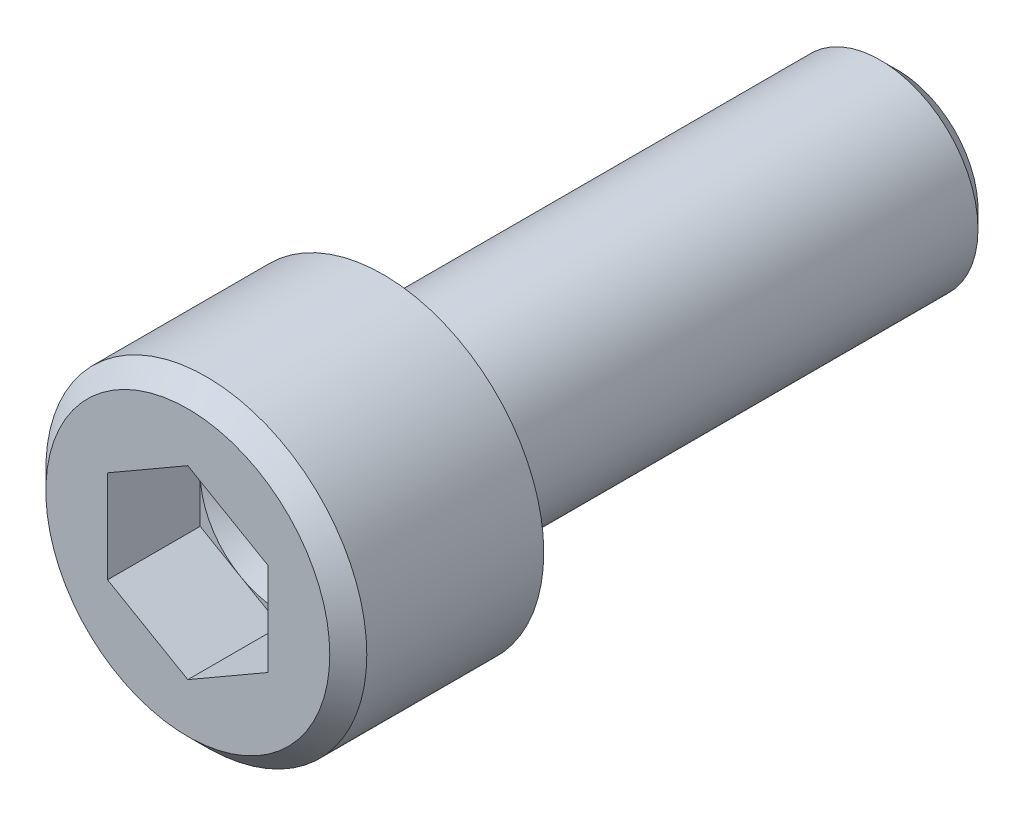
ISO-10303-21;
HEADER;
FILE_DESCRIPTION(('STEP AP214'),'2;1');
FILE_NAME('part.step','',(''),(''),'','','');
FILE_SCHEMA(('AUTOMOTIVE_DESIGN { 1 0 10303 214 1 1 1 1 }'));
ENDSEC;
DATA;
#1=APPLICATION_CONTEXT('core data for automotive mechanical design processes');
#2=APPLICATION_PROTOCOL_DEFINITION('international standard','automotive_design',2000,#1);
#3=PRODUCT_CONTEXT('',#1,'mechanical');
#4=PRODUCT('Part','Part','',(#3));
#5=PRODUCT_RELATED_PRODUCT_CATEGORY('part','',(#4));
#6=PRODUCT_DEFINITION_FORMATION('','',#4);
#7=PRODUCT_DEFINITION_CONTEXT('part definition',#1,'design');
#8=PRODUCT_DEFINITION('design','',#6,#7);
#9=PRODUCT_DEFINITION_SHAPE('','',#8);
#10=(LENGTH_UNIT() NAMED_UNIT(*) SI_UNIT(.MILLI.,.METRE.));
#11=(NAMED_UNIT(*) PLANE_ANGLE_UNIT() SI_UNIT($,.RADIAN.));
#12=(NAMED_UNIT(*) SI_UNIT($,.STERADIAN.) SOLID_ANGLE_UNIT());
#13=UNCERTAINTY_MEASURE_WITH_UNIT(LENGTH_MEASURE(1.E-05),#10,'distance_accuracy_value','');
#14=(GEOMETRIC_REPRESENTATION_CONTEXT(3) GLOBAL_UNCERTAINTY_ASSIGNED_CONTEXT((#13)) GLOBAL_UNIT_ASSIGNED_CONTEXT((#10,
#11,#12)) REPRESENTATION_CONTEXT('',''));
#15=CARTESIAN_POINT('',(0.,0.,0.));
#16=DIRECTION('',(0.,0.,1.));
#17=DIRECTION('',(1.,0.,0.));
#18=AXIS2_PLACEMENT_3D('',#15,#16,#17);
#19=CARTESIAN_POINT('',(0.,0.,2.54));
#20=DIRECTION('',(0.,0.,1.));
#21=DIRECTION('',(1.,0.,0.));
#22=AXIS2_PLACEMENT_3D('',#19,#20,#21);
#23=PLANE('',#22);
#24=DIRECTION('',(0.,1.,0.));
#25=VECTOR('',#24,1.);
#26=CARTESIAN_POINT('',(-1.9812,0.,2.54));
#27=LINE('',#26,#25);
#28=CARTESIAN_POINT('',(-1.9812,0.,2.54));
#29=VERTEX_POINT('',#28);
#30=CARTESIAN_POINT('',(-1.9812,1.14384635331848,2.54));
#31=VERTEX_POINT('',#30);
#32=EDGE_CURVE('E399',#29,#31,#27,.T.);
#33=ORIENTED_EDGE('',*,*,#32,.F.);
#34=CARTESIAN_POINT('',(0.,0.,2.54));
#35=DIRECTION('',(0.,0.,-1.));
#36=DIRECTION('',(-1.,0.,0.));
#37=AXIS2_PLACEMENT_3D('',#34,#35,#36);
#38=CIRCLE('',#37,1.9812);
#39=CARTESIAN_POINT('',(-0.9906,1.71576952997773,2.54));
#40=VERTEX_POINT('',#39);
#41=EDGE_CURVE('E33',#29,#40,#38,.T.);
#42=ORIENTED_EDGE('',*,*,#41,.T.);
#43=DIRECTION('',(0.866025403784439,0.5,0.));
#44=VECTOR('',#43,1.);
#45=CARTESIAN_POINT('',(0.163354175866616,2.38200528404682,2.54));
#46=LINE('',#45,#44);
#47=EDGE_CURVE('E394',#31,#40,#46,.T.);
#48=ORIENTED_EDGE('',*,*,#47,.F.);
#49=EDGE_LOOP('',(#33,#42,#48));
#50=FACE_BOUND('',#49,.T.);
#51=ADVANCED_FACE('F17',(#50),#23,.T.);
#52=CARTESIAN_POINT('',(0.,2.28769270663697,2.54));
#53=VERTEX_POINT('',#52);
#54=EDGE_CURVE('E392',#40,#53,#46,.T.);
#55=ORIENTED_EDGE('',*,*,#54,.F.);
#56=CARTESIAN_POINT('',(0.9906,1.71576952997773,2.54));
#57=VERTEX_POINT('',#56);
#58=EDGE_CURVE('E224',#40,#57,#38,.T.);
#59=ORIENTED_EDGE('',*,*,#58,.T.);
#60=DIRECTION('',(0.866025403784439,-0.5,0.));
#61=VECTOR('',#60,1.);
#62=CARTESIAN_POINT('',(-0.163354175866613,2.38200528404681,2.54));
#63=LINE('',#62,#61);
#64=EDGE_CURVE('E384',#53,#57,#63,.T.);
#65=ORIENTED_EDGE('',*,*,#64,.F.);
#66=EDGE_LOOP('',(#55,#59,#65));
#67=FACE_BOUND('',#66,.T.);
#68=ADVANCED_FACE('F105',(#67),#23,.T.);
#69=CARTESIAN_POINT('',(1.9812,1.14384635331849,2.54));
#70=VERTEX_POINT('',#69);
#71=EDGE_CURVE('E190',#57,#70,#63,.T.);
#72=ORIENTED_EDGE('',*,*,#71,.F.);
#73=CARTESIAN_POINT('',(1.9812,0.,2.54));
#74=VERTEX_POINT('',#73);
#75=EDGE_CURVE('E381',#57,#74,#38,.T.);
#76=ORIENTED_EDGE('',*,*,#75,.T.);
#77=DIRECTION('',(0.,-1.,0.));
#78=VECTOR('',#77,1.);
#79=CARTESIAN_POINT('',(1.9812,0.,2.54));
#80=LINE('',#79,#78);
#81=EDGE_CURVE('E160',#70,#74,#80,.T.);
#82=ORIENTED_EDGE('',*,*,#81,.F.);
#83=EDGE_LOOP('',(#72,#76,#82));
#84=FACE_BOUND('',#83,.T.);
#85=ADVANCED_FACE('F111',(#84),#23,.T.);
#86=CARTESIAN_POINT('',(1.9812,-1.14384635331849,2.54));
#87=VERTEX_POINT('',#86);
#88=EDGE_CURVE('E155',#74,#87,#80,.T.);
#89=ORIENTED_EDGE('',*,*,#88,.F.);
#90=CARTESIAN_POINT('',(0.9906,-1.71576952997773,2.54));
#91=VERTEX_POINT('',#90);
#92=EDGE_CURVE('E417',#74,#91,#38,.T.);
#93=ORIENTED_EDGE('',*,*,#92,.T.);
#94=DIRECTION('',(-0.866025403784438,-0.5,0.));
#95=VECTOR('',#94,1.);
#96=CARTESIAN_POINT('',(2.14455417586661,-1.04953377590865,2.54));
#97=LINE('',#96,#95);
#98=EDGE_CURVE('E148',#87,#91,#97,.T.);
#99=ORIENTED_EDGE('',*,*,#98,.F.);
#100=EDGE_LOOP('',(#89,#93,#99));
#101=FACE_BOUND('',#100,.T.);
#102=ADVANCED_FACE('F129',(#101),#23,.T.);
#103=CARTESIAN_POINT('',(0.,-2.28769270663697,2.54));
#104=VERTEX_POINT('',#103);
#105=EDGE_CURVE('E141',#91,#104,#97,.T.);
#106=ORIENTED_EDGE('',*,*,#105,.F.);
#107=CARTESIAN_POINT('',(-0.9906,-1.71576952997773,2.54));
#108=VERTEX_POINT('',#107);
#109=EDGE_CURVE('E143',#91,#108,#38,.T.);
#110=ORIENTED_EDGE('',*,*,#109,.T.);
#111=DIRECTION('',(-0.866025403784439,0.5,0.));
#112=VECTOR('',#111,1.);
#113=CARTESIAN_POINT('',(-2.14455417586661,-1.04953377590865,2.54));
#114=LINE('',#113,#112);
#115=EDGE_CURVE('E145',#104,#108,#114,.T.);
#116=ORIENTED_EDGE('',*,*,#115,.F.);
#117=EDGE_LOOP('',(#106,#110,#116));
#118=FACE_BOUND('',#117,.T.);
#119=ADVANCED_FACE('F119',(#118),#23,.T.);
#120=CARTESIAN_POINT('',(0.,0.,4.826));
#121=DIRECTION('',(0.,0.,1.));
#122=DIRECTION('',(1.,0.,0.));
#123=AXIS2_PLACEMENT_3D('',#120,#121,#122);
#124=PLANE('',#123);
#125=CARTESIAN_POINT('',(0.,0.,4.826));
#126=DIRECTION('',(0.,0.,1.));
#127=DIRECTION('',(1.,0.,0.));
#128=AXIS2_PLACEMENT_3D('',#125,#126,#127);
#129=CIRCLE('',#128,3.5052);
#130=CARTESIAN_POINT('',(3.5052,0.,4.826));
#131=VERTEX_POINT('',#130);
#132=EDGE_CURVE('E210',#131,#131,#129,.T.);
#133=ORIENTED_EDGE('',*,*,#132,.T.);
#134=EDGE_LOOP('',(#133));
#135=FACE_BOUND('',#134,.T.);
#136=DIRECTION('',(0.866025403784439,0.5,0.));
#137=VECTOR('',#136,1.);
#138=CARTESIAN_POINT('',(0.163354175866616,2.38200528404682,4.826));
#139=LINE('',#138,#137);
#140=CARTESIAN_POINT('',(-1.9812,1.14384635331848,4.826));
#141=VERTEX_POINT('',#140);
#142=CARTESIAN_POINT('',(0.,2.28769270663697,4.826));
#143=VERTEX_POINT('',#142);
#144=EDGE_CURVE('E172',#141,#143,#139,.T.);
#145=ORIENTED_EDGE('',*,*,#144,.T.);
#146=DIRECTION('',(0.866025403784439,-0.5,0.));
#147=VECTOR('',#146,1.);
#148=CARTESIAN_POINT('',(-0.163354175866613,2.38200528404681,4.826));
#149=LINE('',#148,#147);
#150=CARTESIAN_POINT('',(1.9812,1.14384635331849,4.826));
#151=VERTEX_POINT('',#150);
#152=EDGE_CURVE('E168',#143,#151,#149,.T.);
#153=ORIENTED_EDGE('',*,*,#152,.T.);
#154=DIRECTION('',(0.,-1.,0.));
#155=VECTOR('',#154,1.);
#156=CARTESIAN_POINT('',(1.9812,0.,4.826));
#157=LINE('',#156,#155);
#158=CARTESIAN_POINT('',(1.9812,-1.14384635331849,4.826));
#159=VERTEX_POINT('',#158);
#160=EDGE_CURVE('E186',#151,#159,#157,.T.);
#161=ORIENTED_EDGE('',*,*,#160,.T.);
#162=DIRECTION('',(-0.866025403784438,-0.5,0.));
#163=VECTOR('',#162,1.);
#164=CARTESIAN_POINT('',(2.14455417586661,-1.04953377590865,4.826));
#165=LINE('',#164,#163);
#166=CARTESIAN_POINT('',(0.,-2.28769270663697,4.826));
#167=VERTEX_POINT('',#166);
#168=EDGE_CURVE('E41',#159,#167,#165,.T.);
#169=ORIENTED_EDGE('',*,*,#168,.T.);
#170=DIRECTION('',(-0.866025403784439,0.5,0.));
#171=VECTOR('',#170,1.);
#172=CARTESIAN_POINT('',(-2.14455417586661,-1.04953377590865,4.826));
#173=LINE('',#172,#171);
#174=CARTESIAN_POINT('',(-1.9812,-1.14384635331849,4.826));
#175=VERTEX_POINT('',#174);
#176=EDGE_CURVE('E180',#167,#175,#173,.T.);
#177=ORIENTED_EDGE('',*,*,#176,.T.);
#178=DIRECTION('',(0.,1.,0.));
#179=VECTOR('',#178,1.);
#180=CARTESIAN_POINT('',(-1.9812,0.,4.826));
#181=LINE('',#180,#179);
#182=EDGE_CURVE('E176',#175,#141,#181,.T.);
#183=ORIENTED_EDGE('',*,*,#182,.T.);
#184=EDGE_LOOP('',(#145,#153,#161,#169,#177,#183));
#185=FACE_BOUND('',#184,.T.);
#186=ADVANCED_FACE('F128',(#135,#185),#124,.T.);
#187=CARTESIAN_POINT('',(0.,0.,4.826));
#188=DIRECTION('',(0.,0.,-1.));
#189=DIRECTION('',(-1.,0.,0.));
#190=AXIS2_PLACEMENT_3D('',#187,#188,#189);
#191=CYLINDRICAL_SURFACE('',#190,3.9624);
#192=CARTESIAN_POINT('',(0.,0.,4.3688));
#193=DIRECTION('',(0.,0.,1.));
#194=DIRECTION('',(1.,0.,0.));
#195=AXIS2_PLACEMENT_3D('',#192,#193,#194);
#196=CIRCLE('',#195,3.9624);
#197=CARTESIAN_POINT('',(3.9624,0.,4.3688));
#198=VERTEX_POINT('',#197);
#199=EDGE_CURVE('E214',#198,#198,#196,.F.);
#200=ORIENTED_EDGE('',*,*,#199,.T.);
#201=EDGE_LOOP('',(#200));
#202=FACE_BOUND('',#201,.T.);
#203=CARTESIAN_POINT('',(0.,0.,0.));
#204=DIRECTION('',(0.,0.,1.));
#205=DIRECTION('',(1.,0.,0.));
#206=AXIS2_PLACEMENT_3D('',#203,#204,#205);
#207=CIRCLE('',#206,3.9624);
#208=CARTESIAN_POINT('',(3.9624,0.,0.));
#209=VERTEX_POINT('',#208);
#210=EDGE_CURVE('E207',#209,#209,#207,.T.);
#211=ORIENTED_EDGE('',*,*,#210,.T.);
#212=EDGE_LOOP('',(#211));
#213=FACE_BOUND('',#212,.T.);
#214=ADVANCED_FACE('F134',(#202,#213),#191,.T.);
#215=CARTESIAN_POINT('',(0.,0.,0.));
#216=DIRECTION('',(0.,0.,1.));
#217=DIRECTION('',(1.,0.,0.));
#218=AXIS2_PLACEMENT_3D('',#215,#216,#217);
#219=PLANE('',#218);
#220=CARTESIAN_POINT('',(0.,0.,0.));
#221=DIRECTION('',(0.,0.,1.));
#222=DIRECTION('',(1.,0.,0.));
#223=AXIS2_PLACEMENT_3D('',#220,#221,#222);
#224=CIRCLE('',#223,2.5654);
#225=CARTESIAN_POINT('',(2.5654,0.,0.));
#226=VERTEX_POINT('',#225);
#227=EDGE_CURVE('E223',#226,#226,#224,.T.);
#228=ORIENTED_EDGE('',*,*,#227,.T.);
#229=EDGE_LOOP('',(#228));
#230=FACE_BOUND('',#229,.T.);
#231=ORIENTED_EDGE('',*,*,#210,.F.);
#232=EDGE_LOOP('',(#231));
#233=FACE_BOUND('',#232,.T.);
#234=ADVANCED_FACE('F325',(#230,#233),#219,.F.);
#235=CARTESIAN_POINT('',(0.,0.,4.826));
#236=DIRECTION('',(0.,0.,-1.));
#237=DIRECTION('',(-1.,0.,0.));
#238=AXIS2_PLACEMENT_3D('',#235,#236,#237);
#239=CONICAL_SURFACE('',#238,3.5052,0.785398163397449);
#240=ORIENTED_EDGE('',*,*,#199,.F.);
#241=EDGE_LOOP('',(#240));
#242=FACE_BOUND('',#241,.T.);
#243=ORIENTED_EDGE('',*,*,#132,.F.);
#244=EDGE_LOOP('',(#243));
#245=FACE_BOUND('',#244,.T.);
#246=ADVANCED_FACE('F316',(#242,#245),#239,.T.);
#247=CARTESIAN_POINT('',(-0.163354175866613,2.38200528404681,2.54));
#248=DIRECTION('',(-0.5,-0.866025403784439,0.));
#249=DIRECTION('',(0.866025403784439,-0.5,0.));
#250=AXIS2_PLACEMENT_3D('',#247,#248,#249);
#251=PLANE('',#250);
#252=ORIENTED_EDGE('',*,*,#152,.F.);
#253=DIRECTION('',(0.,0.,1.));
#254=VECTOR('',#253,1.);
#255=CARTESIAN_POINT('',(0.,2.28769270663697,2.54));
#256=LINE('',#255,#254);
#257=EDGE_CURVE('E204',#53,#143,#256,.T.);
#258=ORIENTED_EDGE('',*,*,#257,.F.);
#259=ORIENTED_EDGE('',*,*,#64,.T.);
#260=ORIENTED_EDGE('',*,*,#71,.T.);
#261=DIRECTION('',(0.,0.,1.));
#262=VECTOR('',#261,1.);
#263=CARTESIAN_POINT('',(1.9812,1.14384635331849,2.54));
#264=LINE('',#263,#262);
#265=EDGE_CURVE('E167',#70,#151,#264,.T.);
#266=ORIENTED_EDGE('',*,*,#265,.T.);
#267=EDGE_LOOP('',(#252,#258,#259,#260,#266));
#268=FACE_BOUND('',#267,.T.);
#269=ADVANCED_FACE('F307',(#268),#251,.T.);
#270=CARTESIAN_POINT('',(0.163354175866616,2.38200528404682,2.54));
#271=DIRECTION('',(0.5,-0.866025403784438,0.));
#272=DIRECTION('',(0.866025403784438,0.5,0.));
#273=AXIS2_PLACEMENT_3D('',#270,#271,#272);
#274=PLANE('',#273);
#275=ORIENTED_EDGE('',*,*,#144,.F.);
#276=DIRECTION('',(0.,0.,1.));
#277=VECTOR('',#276,1.);
#278=CARTESIAN_POINT('',(-1.9812,1.14384635331848,2.54));
#279=LINE('',#278,#277);
#280=EDGE_CURVE('E201',#31,#141,#279,.T.);
#281=ORIENTED_EDGE('',*,*,#280,.F.);
#282=ORIENTED_EDGE('',*,*,#47,.T.);
#283=ORIENTED_EDGE('',*,*,#54,.T.);
#284=ORIENTED_EDGE('',*,*,#257,.T.);
#285=EDGE_LOOP('',(#275,#281,#282,#283,#284));
#286=FACE_BOUND('',#285,.T.);
#287=ADVANCED_FACE('F298',(#286),#274,.T.);
#288=CARTESIAN_POINT('',(-1.9812,0.,2.54));
#289=DIRECTION('',(1.,0.,0.));
#290=DIRECTION('',(0.,1.,0.));
#291=AXIS2_PLACEMENT_3D('',#288,#289,#290);
#292=PLANE('',#291);
#293=ORIENTED_EDGE('',*,*,#182,.F.);
#294=DIRECTION('',(0.,0.,1.));
#295=VECTOR('',#294,1.);
#296=CARTESIAN_POINT('',(-1.9812,-1.14384635331849,2.54));
#297=LINE('',#296,#295);
#298=CARTESIAN_POINT('',(-1.9812,-1.14384635331849,2.54));
#299=VERTEX_POINT('',#298);
#300=EDGE_CURVE('E198',#299,#175,#297,.T.);
#301=ORIENTED_EDGE('',*,*,#300,.F.);
#302=EDGE_CURVE('E400',#299,#29,#27,.T.);
#303=ORIENTED_EDGE('',*,*,#302,.T.);
#304=ORIENTED_EDGE('',*,*,#32,.T.);
#305=ORIENTED_EDGE('',*,*,#280,.T.);
#306=EDGE_LOOP('',(#293,#301,#303,#304,#305));
#307=FACE_BOUND('',#306,.T.);
#308=ADVANCED_FACE('F289',(#307),#292,.T.);
#309=CARTESIAN_POINT('',(-2.14455417586661,-1.04953377590865,2.54));
#310=DIRECTION('',(0.5,0.866025403784439,0.));
#311=DIRECTION('',(-0.866025403784439,0.5,0.));
#312=AXIS2_PLACEMENT_3D('',#309,#310,#311);
#313=PLANE('',#312);
#314=ORIENTED_EDGE('',*,*,#176,.F.);
#315=DIRECTION('',(0.,0.,1.));
#316=VECTOR('',#315,1.);
#317=CARTESIAN_POINT('',(0.,-2.28769270663697,2.54));
#318=LINE('',#317,#316);
#319=EDGE_CURVE('E195',#104,#167,#318,.T.);
#320=ORIENTED_EDGE('',*,*,#319,.F.);
#321=ORIENTED_EDGE('',*,*,#115,.T.);
#322=EDGE_CURVE('E403',#108,#299,#114,.T.);
#323=ORIENTED_EDGE('',*,*,#322,.T.);
#324=ORIENTED_EDGE('',*,*,#300,.T.);
#325=EDGE_LOOP('',(#314,#320,#321,#323,#324));
#326=FACE_BOUND('',#325,.T.);
#327=ADVANCED_FACE('F281',(#326),#313,.T.);
#328=CARTESIAN_POINT('',(2.14455417586661,-1.04953377590865,2.54));
#329=DIRECTION('',(-0.5,0.866025403784438,0.));
#330=DIRECTION('',(-0.866025403784438,-0.5,0.));
#331=AXIS2_PLACEMENT_3D('',#328,#329,#330);
#332=PLANE('',#331);
#333=ORIENTED_EDGE('',*,*,#168,.F.);
#334=DIRECTION('',(0.,0.,1.));
#335=VECTOR('',#334,1.);
#336=CARTESIAN_POINT('',(1.9812,-1.14384635331849,2.54));
#337=LINE('',#336,#335);
#338=EDGE_CURVE('E151',#87,#159,#337,.T.);
#339=ORIENTED_EDGE('',*,*,#338,.F.);
#340=ORIENTED_EDGE('',*,*,#98,.T.);
#341=ORIENTED_EDGE('',*,*,#105,.T.);
#342=ORIENTED_EDGE('',*,*,#319,.T.);
#343=EDGE_LOOP('',(#333,#339,#340,#341,#342));
#344=FACE_BOUND('',#343,.T.);
#345=ADVANCED_FACE('F124',(#344),#332,.T.);
#346=CARTESIAN_POINT('',(1.9812,0.,2.54));
#347=DIRECTION('',(-1.,0.,0.));
#348=DIRECTION('',(0.,-1.,0.));
#349=AXIS2_PLACEMENT_3D('',#346,#347,#348);
#350=PLANE('',#349);
#351=ORIENTED_EDGE('',*,*,#160,.F.);
#352=ORIENTED_EDGE('',*,*,#265,.F.);
#353=ORIENTED_EDGE('',*,*,#81,.T.);
#354=ORIENTED_EDGE('',*,*,#88,.T.);
#355=ORIENTED_EDGE('',*,*,#338,.T.);
#356=EDGE_LOOP('',(#351,#352,#353,#354,#355));
#357=FACE_BOUND('',#356,.T.);
#358=ADVANCED_FACE('F117',(#357),#350,.T.);
#359=ORIENTED_EDGE('',*,*,#322,.F.);
#360=EDGE_CURVE('E218',#108,#29,#38,.T.);
#361=ORIENTED_EDGE('',*,*,#360,.T.);
#362=ORIENTED_EDGE('',*,*,#302,.F.);
#363=EDGE_LOOP('',(#359,#361,#362));
#364=FACE_BOUND('',#363,.T.);
#365=ADVANCED_FACE('F108',(#364),#23,.T.);
#366=CARTESIAN_POINT('',(0.,0.,-12.7));
#367=DIRECTION('',(0.,0.,1.));
#368=DIRECTION('',(1.,0.,0.));
#369=AXIS2_PLACEMENT_3D('',#366,#367,#368);
#370=CYLINDRICAL_SURFACE('',#369,2.413);
#371=CARTESIAN_POINT('',(0.,0.,-12.27105761938));
#372=DIRECTION('',(0.,0.,-1.));
#373=DIRECTION('',(-1.,0.,0.));
#374=AXIS2_PLACEMENT_3D('',#371,#372,#373);
#375=CIRCLE('',#374,2.413);
#376=CARTESIAN_POINT('',(-2.413,0.,-12.27105761938));
#377=VERTEX_POINT('',#376);
#378=EDGE_CURVE('E11',#377,#377,#375,.F.);
#379=ORIENTED_EDGE('',*,*,#378,.T.);
#380=EDGE_LOOP('',(#379));
#381=FACE_BOUND('',#380,.T.);
#382=CARTESIAN_POINT('',(0.,0.,-0.1524));
#383=DIRECTION('',(0.,0.,1.));
#384=DIRECTION('',(1.,0.,0.));
#385=AXIS2_PLACEMENT_3D('',#382,#383,#384);
#386=CIRCLE('',#385,2.413);
#387=CARTESIAN_POINT('',(2.413,0.,-0.1524));
#388=VERTEX_POINT('',#387);
#389=EDGE_CURVE('E219',#388,#388,#386,.F.);
#390=ORIENTED_EDGE('',*,*,#389,.T.);
#391=EDGE_LOOP('',(#390));
#392=FACE_BOUND('',#391,.T.);
#393=ADVANCED_FACE('F101',(#381,#392),#370,.T.);
#394=CARTESIAN_POINT('',(0.,0.,-12.7));
#395=DIRECTION('',(0.,0.,-1.));
#396=DIRECTION('',(1.,0.,0.));
#397=AXIS2_PLACEMENT_3D('',#394,#395,#396);
#398=PLANE('',#397);
#399=CARTESIAN_POINT('',(0.,0.,-12.7));
#400=DIRECTION('',(0.,0.,-1.));
#401=DIRECTION('',(-1.,0.,0.));
#402=AXIS2_PLACEMENT_3D('',#399,#400,#401);
#403=CIRCLE('',#402,1.98405761938);
#404=CARTESIAN_POINT('',(-1.98405761938,0.,-12.7));
#405=VERTEX_POINT('',#404);
#406=EDGE_CURVE('E26',#405,#405,#403,.T.);
#407=ORIENTED_EDGE('',*,*,#406,.T.);
#408=EDGE_LOOP('',(#407));
#409=FACE_BOUND('',#408,.T.);
#410=ADVANCED_FACE('F94',(#409),#398,.T.);
#411=CARTESIAN_POINT('',(0.,0.,1.39615364668151));
#412=DIRECTION('',(0.,0.,1.));
#413=DIRECTION('',(1.,0.,0.));
#414=AXIS2_PLACEMENT_3D('',#411,#412,#413);
#415=CONICAL_SURFACE('',#414,0.,1.0471975511966);
#416=ORIENTED_EDGE('',*,*,#41,.F.);
#417=ORIENTED_EDGE('',*,*,#360,.F.);
#418=ORIENTED_EDGE('',*,*,#109,.F.);
#419=ORIENTED_EDGE('',*,*,#92,.F.);
#420=ORIENTED_EDGE('',*,*,#75,.F.);
#421=ORIENTED_EDGE('',*,*,#58,.F.);
#422=EDGE_LOOP('',(#416,#417,#418,#419,#420,#421));
#423=FACE_BOUND('',#422,.T.);
#424=CARTESIAN_POINT('',(0.,0.,1.39615364668151));
#425=VERTEX_POINT('',#424);
#426=VERTEX_LOOP('',#425);
#427=FACE_BOUND('',#426,.T.);
#428=ADVANCED_FACE('F91',(#423,#427),#415,.F.);
#429=CARTESIAN_POINT('',(0.,0.,-0.1524));
#430=DIRECTION('',(0.,0.,1.));
#431=DIRECTION('',(1.,0.,0.));
#432=AXIS2_PLACEMENT_3D('',#429,#430,#431);
#433=TOROIDAL_SURFACE('',#432,2.5654,0.1524);
#434=ORIENTED_EDGE('',*,*,#227,.F.);
#435=EDGE_LOOP('',(#434));
#436=FACE_BOUND('',#435,.T.);
#437=ORIENTED_EDGE('',*,*,#389,.F.);
#438=EDGE_LOOP('',(#437));
#439=FACE_BOUND('',#438,.T.);
#440=ADVANCED_FACE('F93',(#436,#439),#433,.F.);
#441=CARTESIAN_POINT('',(0.,0.,-12.7));
#442=DIRECTION('',(0.,0.,1.));
#443=DIRECTION('',(1.,0.,0.));
#444=AXIS2_PLACEMENT_3D('',#441,#442,#443);
#445=CONICAL_SURFACE('',#444,1.98405761938,0.785398163397448);
#446=ORIENTED_EDGE('',*,*,#378,.F.);
#447=EDGE_LOOP('',(#446));
#448=FACE_BOUND('',#447,.T.);
#449=ORIENTED_EDGE('',*,*,#406,.F.);
#450=EDGE_LOOP('',(#449));
#451=FACE_BOUND('',#450,.T.);
#452=ADVANCED_FACE('F19',(#448,#451),#445,.T.);
#453=CLOSED_SHELL('',(#51,#68,#85,#102,#119,#186,#214,#234,#246,#269,#287,#308,#327,#345,#358,
#365,#393,#410,#428,#440,#452));
#454=MANIFOLD_SOLID_BREP('B1',#453);
#455=ADVANCED_BREP_SHAPE_REPRESENTATION('',(#18,#454),#14);
#456=SHAPE_DEFINITION_REPRESENTATION(#9,#455);
ENDSEC;
END-ISO-10303-21;
